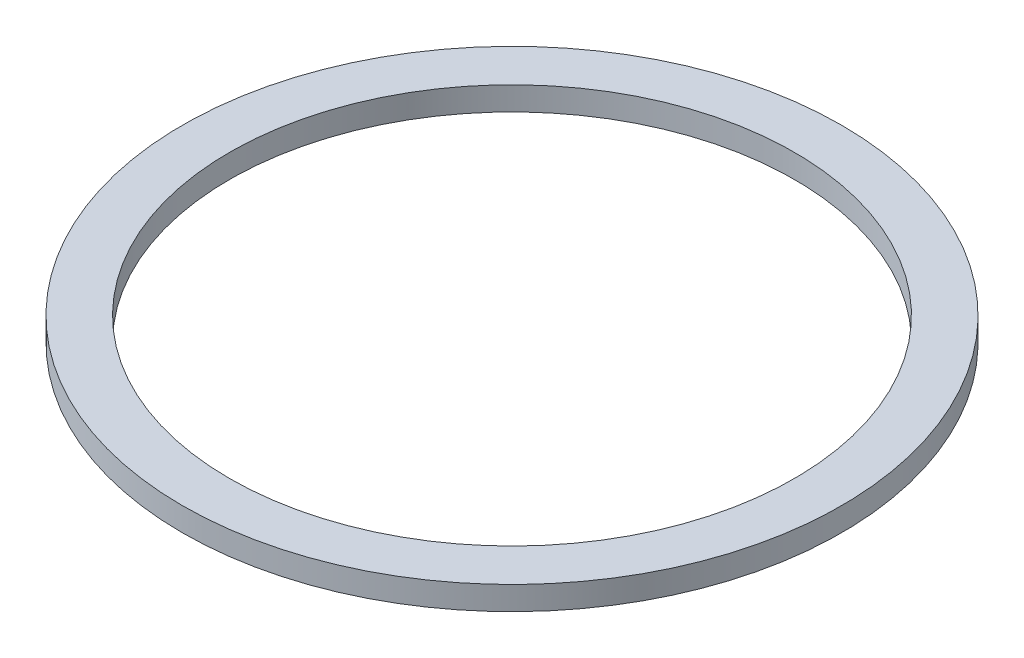
ISO-10303-21;
HEADER;
FILE_DESCRIPTION(('STEP AP214'),'2;1');
FILE_NAME('part.step','',(''),(''),'','','');
FILE_SCHEMA(('AUTOMOTIVE_DESIGN { 1 0 10303 214 1 1 1 1 }'));
ENDSEC;
DATA;
#1=APPLICATION_CONTEXT('core data for automotive mechanical design processes');
#2=APPLICATION_PROTOCOL_DEFINITION('international standard','automotive_design',2000,#1);
#3=PRODUCT_CONTEXT('',#1,'mechanical');
#4=PRODUCT('Part','Part','',(#3));
#5=PRODUCT_RELATED_PRODUCT_CATEGORY('part','',(#4));
#6=PRODUCT_DEFINITION_FORMATION('','',#4);
#7=PRODUCT_DEFINITION_CONTEXT('part definition',#1,'design');
#8=PRODUCT_DEFINITION('design','',#6,#7);
#9=PRODUCT_DEFINITION_SHAPE('','',#8);
#10=(LENGTH_UNIT() NAMED_UNIT(*) SI_UNIT(.MILLI.,.METRE.));
#11=(NAMED_UNIT(*) PLANE_ANGLE_UNIT() SI_UNIT($,.RADIAN.));
#12=(NAMED_UNIT(*) SI_UNIT($,.STERADIAN.) SOLID_ANGLE_UNIT());
#13=UNCERTAINTY_MEASURE_WITH_UNIT(LENGTH_MEASURE(1.E-05),#10,'distance_accuracy_value','');
#14=(GEOMETRIC_REPRESENTATION_CONTEXT(3) GLOBAL_UNCERTAINTY_ASSIGNED_CONTEXT((#13)) GLOBAL_UNIT_ASSIGNED_CONTEXT((#10,
#11,#12)) REPRESENTATION_CONTEXT('',''));
#15=CARTESIAN_POINT('',(0.,0.,0.));
#16=DIRECTION('',(0.,0.,1.));
#17=DIRECTION('',(1.,0.,0.));
#18=AXIS2_PLACEMENT_3D('',#15,#16,#17);
#19=CARTESIAN_POINT('',(0.,0.25,0.));
#20=DIRECTION('',(0.,1.,0.));
#21=DIRECTION('',(0.,0.,1.));
#22=AXIS2_PLACEMENT_3D('',#19,#20,#21);
#23=PLANE('',#22);
#24=CARTESIAN_POINT('',(0.,0.25,0.));
#25=DIRECTION('',(0.,1.,0.));
#26=DIRECTION('',(0.,0.,1.));
#27=AXIS2_PLACEMENT_3D('',#24,#25,#26);
#28=CIRCLE('',#27,7.);
#29=CARTESIAN_POINT('',(0.,0.25,7.));
#30=VERTEX_POINT('',#29);
#31=EDGE_CURVE('E10',#30,#30,#28,.T.);
#32=ORIENTED_EDGE('',*,*,#31,.T.);
#33=EDGE_LOOP('',(#32));
#34=FACE_BOUND('',#33,.T.);
#35=CARTESIAN_POINT('',(0.,0.25,0.));
#36=DIRECTION('',(0.,1.,0.));
#37=DIRECTION('',(0.,0.,1.));
#38=AXIS2_PLACEMENT_3D('',#35,#36,#37);
#39=CIRCLE('',#38,6.);
#40=CARTESIAN_POINT('',(0.,0.25,6.));
#41=VERTEX_POINT('',#40);
#42=EDGE_CURVE('E50',#41,#41,#39,.T.);
#43=ORIENTED_EDGE('',*,*,#42,.F.);
#44=EDGE_LOOP('',(#43));
#45=FACE_BOUND('',#44,.T.);
#46=ADVANCED_FACE('F37',(#34,#45),#23,.T.);
#47=CARTESIAN_POINT('',(0.,-0.25,0.));
#48=DIRECTION('',(0.,1.,0.));
#49=DIRECTION('',(0.,0.,1.));
#50=AXIS2_PLACEMENT_3D('',#47,#48,#49);
#51=PLANE('',#50);
#52=CARTESIAN_POINT('',(0.,-0.25,0.));
#53=DIRECTION('',(0.,1.,0.));
#54=DIRECTION('',(0.,0.,1.));
#55=AXIS2_PLACEMENT_3D('',#52,#53,#54);
#56=CIRCLE('',#55,7.);
#57=CARTESIAN_POINT('',(0.,-0.25,7.));
#58=VERTEX_POINT('',#57);
#59=EDGE_CURVE('E41',#58,#58,#56,.T.);
#60=ORIENTED_EDGE('',*,*,#59,.F.);
#61=EDGE_LOOP('',(#60));
#62=FACE_BOUND('',#61,.T.);
#63=CARTESIAN_POINT('',(0.,-0.25,0.));
#64=DIRECTION('',(0.,1.,0.));
#65=DIRECTION('',(0.,0.,1.));
#66=AXIS2_PLACEMENT_3D('',#63,#64,#65);
#67=CIRCLE('',#66,6.);
#68=CARTESIAN_POINT('',(0.,-0.25,6.));
#69=VERTEX_POINT('',#68);
#70=EDGE_CURVE('E52',#69,#69,#67,.T.);
#71=ORIENTED_EDGE('',*,*,#70,.T.);
#72=EDGE_LOOP('',(#71));
#73=FACE_BOUND('',#72,.T.);
#74=ADVANCED_FACE('F64',(#62,#73),#51,.F.);
#75=CARTESIAN_POINT('',(0.,0.25,0.));
#76=DIRECTION('',(0.,-1.,0.));
#77=DIRECTION('',(0.,0.,-1.));
#78=AXIS2_PLACEMENT_3D('',#75,#76,#77);
#79=CYLINDRICAL_SURFACE('',#78,7.);
#80=ORIENTED_EDGE('',*,*,#31,.F.);
#81=EDGE_LOOP('',(#80));
#82=FACE_BOUND('',#81,.T.);
#83=ORIENTED_EDGE('',*,*,#59,.T.);
#84=EDGE_LOOP('',(#83));
#85=FACE_BOUND('',#84,.T.);
#86=ADVANCED_FACE('F39',(#82,#85),#79,.T.);
#87=CARTESIAN_POINT('',(0.,0.25,0.));
#88=DIRECTION('',(0.,-1.,0.));
#89=DIRECTION('',(0.,0.,-1.));
#90=AXIS2_PLACEMENT_3D('',#87,#88,#89);
#91=CYLINDRICAL_SURFACE('',#90,6.);
#92=ORIENTED_EDGE('',*,*,#42,.T.);
#93=EDGE_LOOP('',(#92));
#94=FACE_BOUND('',#93,.T.);
#95=ORIENTED_EDGE('',*,*,#70,.F.);
#96=EDGE_LOOP('',(#95));
#97=FACE_BOUND('',#96,.T.);
#98=ADVANCED_FACE('F60',(#94,#97),#91,.F.);
#99=CLOSED_SHELL('',(#46,#74,#86,#98));
#100=MANIFOLD_SOLID_BREP('B2',#99);
#101=ADVANCED_BREP_SHAPE_REPRESENTATION('',(#18,#100),#14);
#102=SHAPE_DEFINITION_REPRESENTATION(#9,#101);
ENDSEC;
END-ISO-10303-21;
